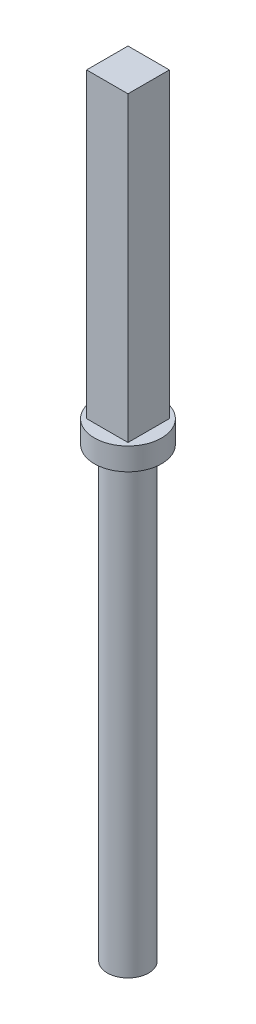
ISO-10303-21;
HEADER;
FILE_DESCRIPTION(('STEP AP214'),'2;1');
FILE_NAME('part.step','',(''),(''),'','','');
FILE_SCHEMA(('AUTOMOTIVE_DESIGN { 1 0 10303 214 1 1 1 1 }'));
ENDSEC;
DATA;
#1=APPLICATION_CONTEXT('core data for automotive mechanical design processes');
#2=APPLICATION_PROTOCOL_DEFINITION('international standard','automotive_design',2000,#1);
#3=PRODUCT_CONTEXT('',#1,'mechanical');
#4=PRODUCT('Part','Part','',(#3));
#5=PRODUCT_RELATED_PRODUCT_CATEGORY('part','',(#4));
#6=PRODUCT_DEFINITION_FORMATION('','',#4);
#7=PRODUCT_DEFINITION_CONTEXT('part definition',#1,'design');
#8=PRODUCT_DEFINITION('design','',#6,#7);
#9=PRODUCT_DEFINITION_SHAPE('','',#8);
#10=(LENGTH_UNIT() NAMED_UNIT(*) SI_UNIT(.MILLI.,.METRE.));
#11=(NAMED_UNIT(*) PLANE_ANGLE_UNIT() SI_UNIT($,.RADIAN.));
#12=(NAMED_UNIT(*) SI_UNIT($,.STERADIAN.) SOLID_ANGLE_UNIT());
#13=UNCERTAINTY_MEASURE_WITH_UNIT(LENGTH_MEASURE(1.E-05),#10,'distance_accuracy_value','');
#14=(GEOMETRIC_REPRESENTATION_CONTEXT(3) GLOBAL_UNCERTAINTY_ASSIGNED_CONTEXT((#13)) GLOBAL_UNIT_ASSIGNED_CONTEXT((#10,
#11,#12)) REPRESENTATION_CONTEXT('',''));
#15=CARTESIAN_POINT('',(0.,0.,0.));
#16=DIRECTION('',(0.,0.,1.));
#17=DIRECTION('',(1.,0.,0.));
#18=AXIS2_PLACEMENT_3D('',#15,#16,#17);
#19=CARTESIAN_POINT('',(0.,40.,0.));
#20=DIRECTION('',(0.,-1.,0.));
#21=DIRECTION('',(0.,0.,-1.));
#22=AXIS2_PLACEMENT_3D('',#19,#20,#21);
#23=CYLINDRICAL_SURFACE('',#22,1.85);
#24=CARTESIAN_POINT('',(0.,40.,0.));
#25=DIRECTION('',(0.,1.,0.));
#26=DIRECTION('',(0.,0.,1.));
#27=AXIS2_PLACEMENT_3D('',#24,#25,#26);
#28=CIRCLE('',#27,1.85);
#29=CARTESIAN_POINT('',(0.,40.,1.85));
#30=VERTEX_POINT('',#29);
#31=EDGE_CURVE('E11',#30,#30,#28,.T.);
#32=ORIENTED_EDGE('',*,*,#31,.F.);
#33=EDGE_LOOP('',(#32));
#34=FACE_BOUND('',#33,.T.);
#35=CARTESIAN_POINT('',(0.,0.,0.));
#36=DIRECTION('',(0.,1.,0.));
#37=DIRECTION('',(0.,0.,1.));
#38=AXIS2_PLACEMENT_3D('',#35,#36,#37);
#39=CIRCLE('',#38,1.85);
#40=CARTESIAN_POINT('',(0.,0.,1.85));
#41=VERTEX_POINT('',#40);
#42=EDGE_CURVE('E48',#41,#41,#39,.T.);
#43=ORIENTED_EDGE('',*,*,#42,.T.);
#44=EDGE_LOOP('',(#43));
#45=FACE_BOUND('',#44,.T.);
#46=ADVANCED_FACE('F45',(#34,#45),#23,.T.);
#47=CARTESIAN_POINT('',(0.,0.,0.));
#48=DIRECTION('',(0.,1.,0.));
#49=DIRECTION('',(0.,0.,1.));
#50=AXIS2_PLACEMENT_3D('',#47,#48,#49);
#51=PLANE('',#50);
#52=ORIENTED_EDGE('',*,*,#42,.F.);
#53=EDGE_LOOP('',(#52));
#54=FACE_BOUND('',#53,.T.);
#55=ADVANCED_FACE('F129',(#54),#51,.F.);
#56=CARTESIAN_POINT('',(0.,42.,0.));
#57=DIRECTION('',(0.,-1.,0.));
#58=DIRECTION('',(0.,0.,-1.));
#59=AXIS2_PLACEMENT_3D('',#56,#57,#58);
#60=CYLINDRICAL_SURFACE('',#59,3.);
#61=CARTESIAN_POINT('',(0.,42.,0.));
#62=DIRECTION('',(0.,1.,0.));
#63=DIRECTION('',(0.,0.,1.));
#64=AXIS2_PLACEMENT_3D('',#61,#62,#63);
#65=CIRCLE('',#64,3.);
#66=CARTESIAN_POINT('',(0.,42.,3.));
#67=VERTEX_POINT('',#66);
#68=EDGE_CURVE('E114',#67,#67,#65,.T.);
#69=ORIENTED_EDGE('',*,*,#68,.F.);
#70=EDGE_LOOP('',(#69));
#71=FACE_BOUND('',#70,.T.);
#72=CARTESIAN_POINT('',(0.,40.,0.));
#73=DIRECTION('',(0.,1.,0.));
#74=DIRECTION('',(0.,0.,1.));
#75=AXIS2_PLACEMENT_3D('',#72,#73,#74);
#76=CIRCLE('',#75,3.);
#77=CARTESIAN_POINT('',(0.,40.,3.));
#78=VERTEX_POINT('',#77);
#79=EDGE_CURVE('E109',#78,#78,#76,.T.);
#80=ORIENTED_EDGE('',*,*,#79,.T.);
#81=EDGE_LOOP('',(#80));
#82=FACE_BOUND('',#81,.T.);
#83=ADVANCED_FACE('F131',(#71,#82),#60,.T.);
#84=CARTESIAN_POINT('',(0.,42.,0.));
#85=DIRECTION('',(0.,1.,0.));
#86=DIRECTION('',(0.,0.,1.));
#87=AXIS2_PLACEMENT_3D('',#84,#85,#86);
#88=PLANE('',#87);
#89=DIRECTION('',(0.,0.,-1.));
#90=VECTOR('',#89,1.);
#91=CARTESIAN_POINT('',(1.85,42.,1.85));
#92=LINE('',#91,#90);
#93=CARTESIAN_POINT('',(1.85,42.,1.85));
#94=VERTEX_POINT('',#93);
#95=CARTESIAN_POINT('',(1.85,42.,-1.85));
#96=VERTEX_POINT('',#95);
#97=EDGE_CURVE('E60',#94,#96,#92,.T.);
#98=ORIENTED_EDGE('',*,*,#97,.F.);
#99=DIRECTION('',(1.,0.,0.));
#100=VECTOR('',#99,1.);
#101=CARTESIAN_POINT('',(-1.85,42.,1.85));
#102=LINE('',#101,#100);
#103=CARTESIAN_POINT('',(-1.85,42.,1.85));
#104=VERTEX_POINT('',#103);
#105=EDGE_CURVE('E64',#104,#94,#102,.T.);
#106=ORIENTED_EDGE('',*,*,#105,.F.);
#107=DIRECTION('',(0.,0.,1.));
#108=VECTOR('',#107,1.);
#109=CARTESIAN_POINT('',(-1.85,42.,1.85));
#110=LINE('',#109,#108);
#111=CARTESIAN_POINT('',(-1.85,42.,-1.85));
#112=VERTEX_POINT('',#111);
#113=EDGE_CURVE('E222',#112,#104,#110,.T.);
#114=ORIENTED_EDGE('',*,*,#113,.F.);
#115=DIRECTION('',(-1.,0.,0.));
#116=VECTOR('',#115,1.);
#117=CARTESIAN_POINT('',(-1.85,42.,-1.85));
#118=LINE('',#117,#116);
#119=EDGE_CURVE('E232',#96,#112,#118,.T.);
#120=ORIENTED_EDGE('',*,*,#119,.F.);
#121=EDGE_LOOP('',(#98,#106,#114,#120));
#122=FACE_BOUND('',#121,.T.);
#123=ORIENTED_EDGE('',*,*,#68,.T.);
#124=EDGE_LOOP('',(#123));
#125=FACE_BOUND('',#124,.T.);
#126=ADVANCED_FACE('F136',(#122,#125),#88,.T.);
#127=CARTESIAN_POINT('',(0.,40.,0.));
#128=DIRECTION('',(0.,1.,0.));
#129=DIRECTION('',(0.,0.,1.));
#130=AXIS2_PLACEMENT_3D('',#127,#128,#129);
#131=PLANE('',#130);
#132=ORIENTED_EDGE('',*,*,#31,.T.);
#133=EDGE_LOOP('',(#132));
#134=FACE_BOUND('',#133,.T.);
#135=ORIENTED_EDGE('',*,*,#79,.F.);
#136=EDGE_LOOP('',(#135));
#137=FACE_BOUND('',#136,.T.);
#138=ADVANCED_FACE('F141',(#134,#137),#131,.F.);
#139=CARTESIAN_POINT('',(1.85,69.,1.85));
#140=DIRECTION('',(-1.,0.,0.));
#141=DIRECTION('',(0.,0.,1.));
#142=AXIS2_PLACEMENT_3D('',#139,#140,#141);
#143=PLANE('',#142);
#144=ORIENTED_EDGE('',*,*,#97,.T.);
#145=DIRECTION('',(0.,-1.,0.));
#146=VECTOR('',#145,1.);
#147=CARTESIAN_POINT('',(1.85,69.,-1.85));
#148=LINE('',#147,#146);
#149=CARTESIAN_POINT('',(1.85,69.,-1.85));
#150=VERTEX_POINT('',#149);
#151=EDGE_CURVE('E89',#150,#96,#148,.T.);
#152=ORIENTED_EDGE('',*,*,#151,.F.);
#153=DIRECTION('',(0.,0.,-1.));
#154=VECTOR('',#153,1.);
#155=CARTESIAN_POINT('',(1.85,69.,1.85));
#156=LINE('',#155,#154);
#157=CARTESIAN_POINT('',(1.85,69.,1.85));
#158=VERTEX_POINT('',#157);
#159=EDGE_CURVE('E96',#158,#150,#156,.T.);
#160=ORIENTED_EDGE('',*,*,#159,.F.);
#161=DIRECTION('',(0.,-1.,0.));
#162=VECTOR('',#161,1.);
#163=CARTESIAN_POINT('',(1.85,69.,1.85));
#164=LINE('',#163,#162);
#165=EDGE_CURVE('E219',#158,#94,#164,.T.);
#166=ORIENTED_EDGE('',*,*,#165,.T.);
#167=EDGE_LOOP('',(#144,#152,#160,#166));
#168=FACE_BOUND('',#167,.T.);
#169=ADVANCED_FACE('F107',(#168),#143,.F.);
#170=CARTESIAN_POINT('',(-1.85,69.,-1.85));
#171=DIRECTION('',(0.,0.,1.));
#172=DIRECTION('',(1.,0.,0.));
#173=AXIS2_PLACEMENT_3D('',#170,#171,#172);
#174=PLANE('',#173);
#175=ORIENTED_EDGE('',*,*,#119,.T.);
#176=DIRECTION('',(0.,-1.,0.));
#177=VECTOR('',#176,1.);
#178=CARTESIAN_POINT('',(-1.85,69.,-1.85));
#179=LINE('',#178,#177);
#180=CARTESIAN_POINT('',(-1.85,69.,-1.85));
#181=VERTEX_POINT('',#180);
#182=EDGE_CURVE('E91',#181,#112,#179,.T.);
#183=ORIENTED_EDGE('',*,*,#182,.F.);
#184=DIRECTION('',(-1.,0.,0.));
#185=VECTOR('',#184,1.);
#186=CARTESIAN_POINT('',(-1.85,69.,-1.85));
#187=LINE('',#186,#185);
#188=EDGE_CURVE('E84',#150,#181,#187,.T.);
#189=ORIENTED_EDGE('',*,*,#188,.F.);
#190=ORIENTED_EDGE('',*,*,#151,.T.);
#191=EDGE_LOOP('',(#175,#183,#189,#190));
#192=FACE_BOUND('',#191,.T.);
#193=ADVANCED_FACE('F87',(#192),#174,.F.);
#194=CARTESIAN_POINT('',(-1.85,69.,1.85));
#195=DIRECTION('',(1.,0.,0.));
#196=DIRECTION('',(0.,0.,-1.));
#197=AXIS2_PLACEMENT_3D('',#194,#195,#196);
#198=PLANE('',#197);
#199=ORIENTED_EDGE('',*,*,#113,.T.);
#200=DIRECTION('',(0.,-1.,0.));
#201=VECTOR('',#200,1.);
#202=CARTESIAN_POINT('',(-1.85,69.,1.85));
#203=LINE('',#202,#201);
#204=CARTESIAN_POINT('',(-1.85,69.,1.85));
#205=VERTEX_POINT('',#204);
#206=EDGE_CURVE('E116',#205,#104,#203,.T.);
#207=ORIENTED_EDGE('',*,*,#206,.F.);
#208=DIRECTION('',(0.,0.,1.));
#209=VECTOR('',#208,1.);
#210=CARTESIAN_POINT('',(-1.85,69.,1.85));
#211=LINE('',#210,#209);
#212=EDGE_CURVE('E95',#181,#205,#211,.T.);
#213=ORIENTED_EDGE('',*,*,#212,.F.);
#214=ORIENTED_EDGE('',*,*,#182,.T.);
#215=EDGE_LOOP('',(#199,#207,#213,#214));
#216=FACE_BOUND('',#215,.T.);
#217=ADVANCED_FACE('F151',(#216),#198,.F.);
#218=CARTESIAN_POINT('',(-1.85,69.,1.85));
#219=DIRECTION('',(0.,0.,-1.));
#220=DIRECTION('',(-1.,0.,0.));
#221=AXIS2_PLACEMENT_3D('',#218,#219,#220);
#222=PLANE('',#221);
#223=ORIENTED_EDGE('',*,*,#105,.T.);
#224=ORIENTED_EDGE('',*,*,#165,.F.);
#225=DIRECTION('',(1.,0.,0.));
#226=VECTOR('',#225,1.);
#227=CARTESIAN_POINT('',(-1.85,69.,1.85));
#228=LINE('',#227,#226);
#229=EDGE_CURVE('E101',#205,#158,#228,.T.);
#230=ORIENTED_EDGE('',*,*,#229,.F.);
#231=ORIENTED_EDGE('',*,*,#206,.T.);
#232=EDGE_LOOP('',(#223,#224,#230,#231));
#233=FACE_BOUND('',#232,.T.);
#234=ADVANCED_FACE('F154',(#233),#222,.F.);
#235=CARTESIAN_POINT('',(0.,69.,0.));
#236=DIRECTION('',(0.,-1.,0.));
#237=DIRECTION('',(0.,0.,-1.));
#238=AXIS2_PLACEMENT_3D('',#235,#236,#237);
#239=PLANE('',#238);
#240=ORIENTED_EDGE('',*,*,#159,.T.);
#241=ORIENTED_EDGE('',*,*,#188,.T.);
#242=ORIENTED_EDGE('',*,*,#212,.T.);
#243=ORIENTED_EDGE('',*,*,#229,.T.);
#244=EDGE_LOOP('',(#240,#241,#242,#243));
#245=FACE_BOUND('',#244,.T.);
#246=ADVANCED_FACE('F99',(#245),#239,.F.);
#247=CLOSED_SHELL('',(#46,#55,#83,#126,#138,#169,#193,#217,#234,#246));
#248=MANIFOLD_SOLID_BREP('B2',#247);
#249=ADVANCED_BREP_SHAPE_REPRESENTATION('',(#18,#248),#14);
#250=SHAPE_DEFINITION_REPRESENTATION(#9,#249);
ENDSEC;
END-ISO-10303-21;
